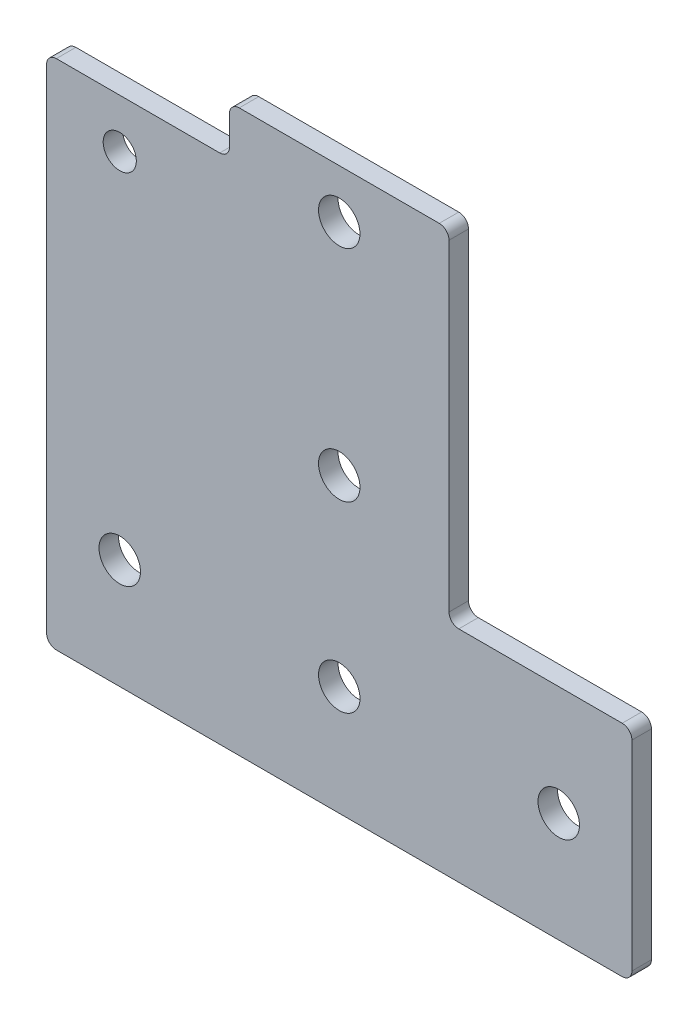
ISO-10303-21;
HEADER;
FILE_DESCRIPTION(('STEP AP214'),'2;1');
FILE_NAME('part.step','',(''),(''),'','','');
FILE_SCHEMA(('AUTOMOTIVE_DESIGN { 1 0 10303 214 1 1 1 1 }'));
ENDSEC;
DATA;
#1=APPLICATION_CONTEXT('core data for automotive mechanical design processes');
#2=APPLICATION_PROTOCOL_DEFINITION('international standard','automotive_design',2000,#1);
#3=PRODUCT_CONTEXT('',#1,'mechanical');
#4=PRODUCT('Part','Part','',(#3));
#5=PRODUCT_RELATED_PRODUCT_CATEGORY('part','',(#4));
#6=PRODUCT_DEFINITION_FORMATION('','',#4);
#7=PRODUCT_DEFINITION_CONTEXT('part definition',#1,'design');
#8=PRODUCT_DEFINITION('design','',#6,#7);
#9=PRODUCT_DEFINITION_SHAPE('','',#8);
#10=(LENGTH_UNIT() NAMED_UNIT(*) SI_UNIT(.MILLI.,.METRE.));
#11=(NAMED_UNIT(*) PLANE_ANGLE_UNIT() SI_UNIT($,.RADIAN.));
#12=(NAMED_UNIT(*) SI_UNIT($,.STERADIAN.) SOLID_ANGLE_UNIT());
#13=UNCERTAINTY_MEASURE_WITH_UNIT(LENGTH_MEASURE(1.E-05),#10,'distance_accuracy_value','');
#14=(GEOMETRIC_REPRESENTATION_CONTEXT(3) GLOBAL_UNCERTAINTY_ASSIGNED_CONTEXT((#13)) GLOBAL_UNIT_ASSIGNED_CONTEXT((#10,
#11,#12)) REPRESENTATION_CONTEXT('',''));
#15=CARTESIAN_POINT('',(0.,0.,0.));
#16=DIRECTION('',(0.,0.,1.));
#17=DIRECTION('',(1.,0.,0.));
#18=AXIS2_PLACEMENT_3D('',#15,#16,#17);
#19=CARTESIAN_POINT('',(0.,0.,4.));
#20=DIRECTION('',(0.,0.,-1.));
#21=DIRECTION('',(-1.,0.,0.));
#22=AXIS2_PLACEMENT_3D('',#19,#20,#21);
#23=PLANE('',#22);
#24=DIRECTION('',(-1.,0.,0.));
#25=VECTOR('',#24,1.);
#26=CARTESIAN_POINT('',(-60.,105.,4.));
#27=LINE('',#26,#25);
#28=CARTESIAN_POINT('',(-24.5,105.,4.));
#29=VERTEX_POINT('',#28);
#30=CARTESIAN_POINT('',(-58.,105.,4.));
#31=VERTEX_POINT('',#30);
#32=EDGE_CURVE('E192',#29,#31,#27,.T.);
#33=ORIENTED_EDGE('',*,*,#32,.T.);
#34=CARTESIAN_POINT('',(-58.,103.,4.));
#35=DIRECTION('',(0.,0.,-1.));
#36=DIRECTION('',(-1.,0.,0.));
#37=AXIS2_PLACEMENT_3D('',#34,#35,#36);
#38=CIRCLE('',#37,2.);
#39=CARTESIAN_POINT('',(-60.,103.,4.));
#40=VERTEX_POINT('',#39);
#41=EDGE_CURVE('E219',#31,#40,#38,.F.);
#42=ORIENTED_EDGE('',*,*,#41,.T.);
#43=DIRECTION('',(0.,-1.,0.));
#44=VECTOR('',#43,1.);
#45=CARTESIAN_POINT('',(-60.,0.,4.));
#46=LINE('',#45,#44);
#47=CARTESIAN_POINT('',(-60.,2.,4.));
#48=VERTEX_POINT('',#47);
#49=EDGE_CURVE('E176',#40,#48,#46,.T.);
#50=ORIENTED_EDGE('',*,*,#49,.T.);
#51=CARTESIAN_POINT('',(-58.,2.,4.));
#52=DIRECTION('',(0.,0.,-1.));
#53=DIRECTION('',(-1.,0.,0.));
#54=AXIS2_PLACEMENT_3D('',#51,#52,#53);
#55=CIRCLE('',#54,2.);
#56=CARTESIAN_POINT('',(-58.,0.,4.));
#57=VERTEX_POINT('',#56);
#58=EDGE_CURVE('E216',#48,#57,#55,.F.);
#59=ORIENTED_EDGE('',*,*,#58,.T.);
#60=DIRECTION('',(1.,0.,0.));
#61=VECTOR('',#60,1.);
#62=CARTESIAN_POINT('',(-60.,0.,4.));
#63=LINE('',#62,#61);
#64=CARTESIAN_POINT('',(58.,0.,4.));
#65=VERTEX_POINT('',#64);
#66=EDGE_CURVE('E186',#57,#65,#63,.T.);
#67=ORIENTED_EDGE('',*,*,#66,.T.);
#68=CARTESIAN_POINT('',(58.,2.,4.));
#69=DIRECTION('',(0.,0.,-1.));
#70=DIRECTION('',(-1.,0.,0.));
#71=AXIS2_PLACEMENT_3D('',#68,#69,#70);
#72=CIRCLE('',#71,2.);
#73=CARTESIAN_POINT('',(60.,2.,4.));
#74=VERTEX_POINT('',#73);
#75=EDGE_CURVE('E205',#65,#74,#72,.F.);
#76=ORIENTED_EDGE('',*,*,#75,.T.);
#77=DIRECTION('',(0.,1.,0.));
#78=VECTOR('',#77,1.);
#79=CARTESIAN_POINT('',(60.,0.,4.));
#80=LINE('',#79,#78);
#81=CARTESIAN_POINT('',(60.,43.,4.));
#82=VERTEX_POINT('',#81);
#83=EDGE_CURVE('E288',#74,#82,#80,.T.);
#84=ORIENTED_EDGE('',*,*,#83,.T.);
#85=CARTESIAN_POINT('',(58.,43.,4.));
#86=DIRECTION('',(0.,0.,-1.));
#87=DIRECTION('',(-1.,0.,0.));
#88=AXIS2_PLACEMENT_3D('',#85,#86,#87);
#89=CIRCLE('',#88,2.);
#90=CARTESIAN_POINT('',(58.,45.,4.));
#91=VERTEX_POINT('',#90);
#92=EDGE_CURVE('E208',#82,#91,#89,.F.);
#93=ORIENTED_EDGE('',*,*,#92,.T.);
#94=DIRECTION('',(-1.,0.,0.));
#95=VECTOR('',#94,1.);
#96=CARTESIAN_POINT('',(22.5,45.,4.));
#97=LINE('',#96,#95);
#98=CARTESIAN_POINT('',(24.5,45.,4.));
#99=VERTEX_POINT('',#98);
#100=EDGE_CURVE('E292',#91,#99,#97,.T.);
#101=ORIENTED_EDGE('',*,*,#100,.T.);
#102=CARTESIAN_POINT('',(24.5,47.,4.));
#103=DIRECTION('',(0.,0.,-1.));
#104=DIRECTION('',(-1.,0.,0.));
#105=AXIS2_PLACEMENT_3D('',#102,#103,#104);
#106=CIRCLE('',#105,2.);
#107=CARTESIAN_POINT('',(22.5,47.,4.));
#108=VERTEX_POINT('',#107);
#109=EDGE_CURVE('E12',#99,#108,#106,.T.);
#110=ORIENTED_EDGE('',*,*,#109,.T.);
#111=DIRECTION('',(0.,1.,0.));
#112=VECTOR('',#111,1.);
#113=CARTESIAN_POINT('',(22.5,45.,4.));
#114=LINE('',#113,#112);
#115=CARTESIAN_POINT('',(22.5,113.,4.));
#116=VERTEX_POINT('',#115);
#117=EDGE_CURVE('E297',#108,#116,#114,.T.);
#118=ORIENTED_EDGE('',*,*,#117,.T.);
#119=CARTESIAN_POINT('',(20.5,113.,4.));
#120=DIRECTION('',(0.,0.,-1.));
#121=DIRECTION('',(-1.,0.,0.));
#122=AXIS2_PLACEMENT_3D('',#119,#120,#121);
#123=CIRCLE('',#122,2.);
#124=CARTESIAN_POINT('',(20.5,115.,4.));
#125=VERTEX_POINT('',#124);
#126=EDGE_CURVE('E211',#116,#125,#123,.F.);
#127=ORIENTED_EDGE('',*,*,#126,.T.);
#128=DIRECTION('',(-1.,0.,0.));
#129=VECTOR('',#128,1.);
#130=CARTESIAN_POINT('',(-22.5,115.,4.));
#131=LINE('',#130,#129);
#132=CARTESIAN_POINT('',(-20.5,115.,4.));
#133=VERTEX_POINT('',#132);
#134=EDGE_CURVE('E302',#125,#133,#131,.T.);
#135=ORIENTED_EDGE('',*,*,#134,.T.);
#136=CARTESIAN_POINT('',(-20.5,113.,4.));
#137=DIRECTION('',(0.,0.,-1.));
#138=DIRECTION('',(-1.,0.,0.));
#139=AXIS2_PLACEMENT_3D('',#136,#137,#138);
#140=CIRCLE('',#139,2.);
#141=CARTESIAN_POINT('',(-22.5,113.,4.));
#142=VERTEX_POINT('',#141);
#143=EDGE_CURVE('E64',#133,#142,#140,.F.);
#144=ORIENTED_EDGE('',*,*,#143,.T.);
#145=DIRECTION('',(0.,-1.,0.));
#146=VECTOR('',#145,1.);
#147=CARTESIAN_POINT('',(-22.5,105.,4.));
#148=LINE('',#147,#146);
#149=CARTESIAN_POINT('',(-22.5,107.,4.));
#150=VERTEX_POINT('',#149);
#151=EDGE_CURVE('E306',#142,#150,#148,.T.);
#152=ORIENTED_EDGE('',*,*,#151,.T.);
#153=CARTESIAN_POINT('',(-24.5,107.,4.));
#154=DIRECTION('',(0.,0.,-1.));
#155=DIRECTION('',(-1.,0.,0.));
#156=AXIS2_PLACEMENT_3D('',#153,#154,#155);
#157=CIRCLE('',#156,2.);
#158=EDGE_CURVE('E253',#150,#29,#157,.T.);
#159=ORIENTED_EDGE('',*,*,#158,.T.);
#160=EDGE_LOOP('',(#33,#42,#50,#59,#67,#76,#84,#93,#101,#110,#118,#127,#135,#144,#152,#159));
#161=FACE_BOUND('',#160,.T.);
#162=CARTESIAN_POINT('',(-45.,95.,4.));
#163=DIRECTION('',(0.,0.,1.));
#164=DIRECTION('',(1.,0.,0.));
#165=AXIS2_PLACEMENT_3D('',#162,#163,#164);
#166=CIRCLE('',#165,3.4);
#167=CARTESIAN_POINT('',(-41.6,95.,4.));
#168=VERTEX_POINT('',#167);
#169=EDGE_CURVE('E265',#168,#168,#166,.T.);
#170=ORIENTED_EDGE('',*,*,#169,.F.);
#171=EDGE_LOOP('',(#170));
#172=FACE_BOUND('',#171,.T.);
#173=CARTESIAN_POINT('',(0.,22.5,4.));
#174=DIRECTION('',(0.,0.,1.));
#175=DIRECTION('',(1.,0.,0.));
#176=AXIS2_PLACEMENT_3D('',#173,#174,#175);
#177=CIRCLE('',#176,4.25);
#178=CARTESIAN_POINT('',(4.25000000000001,22.5,4.));
#179=VERTEX_POINT('',#178);
#180=EDGE_CURVE('E275',#179,#179,#177,.T.);
#181=ORIENTED_EDGE('',*,*,#180,.F.);
#182=EDGE_LOOP('',(#181));
#183=FACE_BOUND('',#182,.T.);
#184=CARTESIAN_POINT('',(-45.,22.5,4.));
#185=DIRECTION('',(0.,0.,1.));
#186=DIRECTION('',(1.,0.,0.));
#187=AXIS2_PLACEMENT_3D('',#184,#185,#186);
#188=CIRCLE('',#187,4.25);
#189=CARTESIAN_POINT('',(-40.75,22.5,4.));
#190=VERTEX_POINT('',#189);
#191=EDGE_CURVE('E411',#190,#190,#188,.T.);
#192=ORIENTED_EDGE('',*,*,#191,.F.);
#193=EDGE_LOOP('',(#192));
#194=FACE_BOUND('',#193,.T.);
#195=CARTESIAN_POINT('',(45.,22.5,4.));
#196=DIRECTION('',(0.,0.,1.));
#197=DIRECTION('',(1.,0.,0.));
#198=AXIS2_PLACEMENT_3D('',#195,#196,#197);
#199=CIRCLE('',#198,4.25);
#200=CARTESIAN_POINT('',(49.25,22.5,4.));
#201=VERTEX_POINT('',#200);
#202=EDGE_CURVE('E404',#201,#201,#199,.T.);
#203=ORIENTED_EDGE('',*,*,#202,.F.);
#204=EDGE_LOOP('',(#203));
#205=FACE_BOUND('',#204,.T.);
#206=CARTESIAN_POINT('',(0.,105.,4.));
#207=DIRECTION('',(0.,0.,1.));
#208=DIRECTION('',(1.,0.,0.));
#209=AXIS2_PLACEMENT_3D('',#206,#207,#208);
#210=CIRCLE('',#209,4.25000000000001);
#211=CARTESIAN_POINT('',(4.25000000000001,105.,4.));
#212=VERTEX_POINT('',#211);
#213=EDGE_CURVE('E395',#212,#212,#210,.T.);
#214=ORIENTED_EDGE('',*,*,#213,.F.);
#215=EDGE_LOOP('',(#214));
#216=FACE_BOUND('',#215,.T.);
#217=CARTESIAN_POINT('',(0.,60.,4.));
#218=DIRECTION('',(0.,0.,1.));
#219=DIRECTION('',(1.,0.,0.));
#220=AXIS2_PLACEMENT_3D('',#217,#218,#219);
#221=CIRCLE('',#220,4.25000000000001);
#222=CARTESIAN_POINT('',(4.25000000000002,60.,4.));
#223=VERTEX_POINT('',#222);
#224=EDGE_CURVE('E385',#223,#223,#221,.T.);
#225=ORIENTED_EDGE('',*,*,#224,.F.);
#226=EDGE_LOOP('',(#225));
#227=FACE_BOUND('',#226,.T.);
#228=ADVANCED_FACE('F40',(#161,#172,#183,#194,#205,#216,#227),#23,.F.);
#229=CARTESIAN_POINT('',(0.,0.,0.));
#230=DIRECTION('',(0.,0.,-1.));
#231=DIRECTION('',(-1.,0.,0.));
#232=AXIS2_PLACEMENT_3D('',#229,#230,#231);
#233=PLANE('',#232);
#234=CARTESIAN_POINT('',(0.,105.,0.));
#235=DIRECTION('',(0.,0.,1.));
#236=DIRECTION('',(1.,0.,0.));
#237=AXIS2_PLACEMENT_3D('',#234,#235,#236);
#238=CIRCLE('',#237,4.25000000000001);
#239=CARTESIAN_POINT('',(4.25000000000001,105.,0.));
#240=VERTEX_POINT('',#239);
#241=EDGE_CURVE('E392',#240,#240,#238,.T.);
#242=ORIENTED_EDGE('',*,*,#241,.T.);
#243=EDGE_LOOP('',(#242));
#244=FACE_BOUND('',#243,.T.);
#245=CARTESIAN_POINT('',(-45.,22.5,0.));
#246=DIRECTION('',(0.,0.,1.));
#247=DIRECTION('',(1.,0.,0.));
#248=AXIS2_PLACEMENT_3D('',#245,#246,#247);
#249=CIRCLE('',#248,4.25);
#250=CARTESIAN_POINT('',(-40.75,22.5,0.));
#251=VERTEX_POINT('',#250);
#252=EDGE_CURVE('E409',#251,#251,#249,.T.);
#253=ORIENTED_EDGE('',*,*,#252,.T.);
#254=EDGE_LOOP('',(#253));
#255=FACE_BOUND('',#254,.T.);
#256=CARTESIAN_POINT('',(-45.,95.,0.));
#257=DIRECTION('',(0.,0.,1.));
#258=DIRECTION('',(1.,0.,0.));
#259=AXIS2_PLACEMENT_3D('',#256,#257,#258);
#260=CIRCLE('',#259,3.4);
#261=CARTESIAN_POINT('',(-41.6,95.,0.));
#262=VERTEX_POINT('',#261);
#263=EDGE_CURVE('E272',#262,#262,#260,.T.);
#264=ORIENTED_EDGE('',*,*,#263,.T.);
#265=EDGE_LOOP('',(#264));
#266=FACE_BOUND('',#265,.T.);
#267=DIRECTION('',(0.,-1.,0.));
#268=VECTOR('',#267,1.);
#269=CARTESIAN_POINT('',(-60.,45.,0.));
#270=LINE('',#269,#268);
#271=CARTESIAN_POINT('',(-60.,103.,0.));
#272=VERTEX_POINT('',#271);
#273=CARTESIAN_POINT('',(-60.,2.,0.));
#274=VERTEX_POINT('',#273);
#275=EDGE_CURVE('E173',#272,#274,#270,.T.);
#276=ORIENTED_EDGE('',*,*,#275,.F.);
#277=CARTESIAN_POINT('',(-58.,103.,0.));
#278=DIRECTION('',(0.,0.,-1.));
#279=DIRECTION('',(-1.,0.,0.));
#280=AXIS2_PLACEMENT_3D('',#277,#278,#279);
#281=CIRCLE('',#280,2.);
#282=CARTESIAN_POINT('',(-58.,105.,0.));
#283=VERTEX_POINT('',#282);
#284=EDGE_CURVE('E156',#272,#283,#281,.T.);
#285=ORIENTED_EDGE('',*,*,#284,.T.);
#286=DIRECTION('',(-1.,0.,0.));
#287=VECTOR('',#286,1.);
#288=CARTESIAN_POINT('',(-60.,105.,0.));
#289=LINE('',#288,#287);
#290=CARTESIAN_POINT('',(-24.5,105.,0.));
#291=VERTEX_POINT('',#290);
#292=EDGE_CURVE('E183',#291,#283,#289,.T.);
#293=ORIENTED_EDGE('',*,*,#292,.F.);
#294=CARTESIAN_POINT('',(-24.5,107.,0.));
#295=DIRECTION('',(0.,0.,-1.));
#296=DIRECTION('',(-1.,0.,0.));
#297=AXIS2_PLACEMENT_3D('',#294,#295,#296);
#298=CIRCLE('',#297,2.);
#299=CARTESIAN_POINT('',(-22.5,107.,0.));
#300=VERTEX_POINT('',#299);
#301=EDGE_CURVE('E251',#291,#300,#298,.F.);
#302=ORIENTED_EDGE('',*,*,#301,.T.);
#303=DIRECTION('',(0.,-1.,0.));
#304=VECTOR('',#303,1.);
#305=CARTESIAN_POINT('',(-22.5,105.,0.));
#306=LINE('',#305,#304);
#307=CARTESIAN_POINT('',(-22.5,113.,0.));
#308=VERTEX_POINT('',#307);
#309=EDGE_CURVE('E188',#308,#300,#306,.T.);
#310=ORIENTED_EDGE('',*,*,#309,.F.);
#311=CARTESIAN_POINT('',(-20.5,113.,0.));
#312=DIRECTION('',(0.,0.,-1.));
#313=DIRECTION('',(-1.,0.,0.));
#314=AXIS2_PLACEMENT_3D('',#311,#312,#313);
#315=CIRCLE('',#314,2.);
#316=CARTESIAN_POINT('',(-20.5,115.,0.));
#317=VERTEX_POINT('',#316);
#318=EDGE_CURVE('E199',#308,#317,#315,.T.);
#319=ORIENTED_EDGE('',*,*,#318,.T.);
#320=DIRECTION('',(-1.,0.,0.));
#321=VECTOR('',#320,1.);
#322=CARTESIAN_POINT('',(-22.5,115.,0.));
#323=LINE('',#322,#321);
#324=CARTESIAN_POINT('',(20.5,115.,0.));
#325=VERTEX_POINT('',#324);
#326=EDGE_CURVE('E324',#325,#317,#323,.T.);
#327=ORIENTED_EDGE('',*,*,#326,.F.);
#328=CARTESIAN_POINT('',(20.5,113.,0.));
#329=DIRECTION('',(0.,0.,-1.));
#330=DIRECTION('',(-1.,0.,0.));
#331=AXIS2_PLACEMENT_3D('',#328,#329,#330);
#332=CIRCLE('',#331,2.);
#333=CARTESIAN_POINT('',(22.5,113.,0.));
#334=VERTEX_POINT('',#333);
#335=EDGE_CURVE('E197',#325,#334,#332,.T.);
#336=ORIENTED_EDGE('',*,*,#335,.T.);
#337=DIRECTION('',(0.,1.,0.));
#338=VECTOR('',#337,1.);
#339=CARTESIAN_POINT('',(22.5,45.,0.));
#340=LINE('',#339,#338);
#341=CARTESIAN_POINT('',(22.5,47.,0.));
#342=VERTEX_POINT('',#341);
#343=EDGE_CURVE('E321',#342,#334,#340,.T.);
#344=ORIENTED_EDGE('',*,*,#343,.F.);
#345=CARTESIAN_POINT('',(24.5,47.,0.));
#346=DIRECTION('',(0.,0.,-1.));
#347=DIRECTION('',(-1.,0.,0.));
#348=AXIS2_PLACEMENT_3D('',#345,#346,#347);
#349=CIRCLE('',#348,2.);
#350=CARTESIAN_POINT('',(24.5,45.,0.));
#351=VERTEX_POINT('',#350);
#352=EDGE_CURVE('E50',#342,#351,#349,.F.);
#353=ORIENTED_EDGE('',*,*,#352,.T.);
#354=DIRECTION('',(-1.,0.,0.));
#355=VECTOR('',#354,1.);
#356=CARTESIAN_POINT('',(22.5,45.,0.));
#357=LINE('',#356,#355);
#358=CARTESIAN_POINT('',(58.,45.,0.));
#359=VERTEX_POINT('',#358);
#360=EDGE_CURVE('E318',#359,#351,#357,.T.);
#361=ORIENTED_EDGE('',*,*,#360,.F.);
#362=CARTESIAN_POINT('',(58.,43.,0.));
#363=DIRECTION('',(0.,0.,-1.));
#364=DIRECTION('',(-1.,0.,0.));
#365=AXIS2_PLACEMENT_3D('',#362,#363,#364);
#366=CIRCLE('',#365,2.);
#367=CARTESIAN_POINT('',(60.,43.,0.));
#368=VERTEX_POINT('',#367);
#369=EDGE_CURVE('E195',#359,#368,#366,.T.);
#370=ORIENTED_EDGE('',*,*,#369,.T.);
#371=DIRECTION('',(0.,1.,0.));
#372=VECTOR('',#371,1.);
#373=CARTESIAN_POINT('',(60.,0.,0.));
#374=LINE('',#373,#372);
#375=CARTESIAN_POINT('',(60.,2.,0.));
#376=VERTEX_POINT('',#375);
#377=EDGE_CURVE('E315',#376,#368,#374,.T.);
#378=ORIENTED_EDGE('',*,*,#377,.F.);
#379=CARTESIAN_POINT('',(58.,2.,0.));
#380=DIRECTION('',(0.,0.,-1.));
#381=DIRECTION('',(-1.,0.,0.));
#382=AXIS2_PLACEMENT_3D('',#379,#380,#381);
#383=CIRCLE('',#382,2.);
#384=CARTESIAN_POINT('',(58.,0.,0.));
#385=VERTEX_POINT('',#384);
#386=EDGE_CURVE('E177',#376,#385,#383,.T.);
#387=ORIENTED_EDGE('',*,*,#386,.T.);
#388=DIRECTION('',(1.,0.,0.));
#389=VECTOR('',#388,1.);
#390=CARTESIAN_POINT('',(-60.,0.,0.));
#391=LINE('',#390,#389);
#392=CARTESIAN_POINT('',(-58.,0.,0.));
#393=VERTEX_POINT('',#392);
#394=EDGE_CURVE('E271',#393,#385,#391,.T.);
#395=ORIENTED_EDGE('',*,*,#394,.F.);
#396=CARTESIAN_POINT('',(-58.,2.,0.));
#397=DIRECTION('',(0.,0.,-1.));
#398=DIRECTION('',(-1.,0.,0.));
#399=AXIS2_PLACEMENT_3D('',#396,#397,#398);
#400=CIRCLE('',#399,2.);
#401=EDGE_CURVE('E167',#393,#274,#400,.T.);
#402=ORIENTED_EDGE('',*,*,#401,.T.);
#403=EDGE_LOOP('',(#276,#285,#293,#302,#310,#319,#327,#336,#344,#353,#361,#370,#378,#387,#395,#402));
#404=FACE_BOUND('',#403,.T.);
#405=CARTESIAN_POINT('',(0.,22.5,0.));
#406=DIRECTION('',(0.,0.,1.));
#407=DIRECTION('',(1.,0.,0.));
#408=AXIS2_PLACEMENT_3D('',#405,#406,#407);
#409=CIRCLE('',#408,4.25);
#410=CARTESIAN_POINT('',(4.25000000000001,22.5,0.));
#411=VERTEX_POINT('',#410);
#412=EDGE_CURVE('E273',#411,#411,#409,.T.);
#413=ORIENTED_EDGE('',*,*,#412,.T.);
#414=EDGE_LOOP('',(#413));
#415=FACE_BOUND('',#414,.T.);
#416=CARTESIAN_POINT('',(45.,22.5,0.));
#417=DIRECTION('',(0.,0.,1.));
#418=DIRECTION('',(1.,0.,0.));
#419=AXIS2_PLACEMENT_3D('',#416,#417,#418);
#420=CIRCLE('',#419,4.25);
#421=CARTESIAN_POINT('',(49.25,22.5,0.));
#422=VERTEX_POINT('',#421);
#423=EDGE_CURVE('E400',#422,#422,#420,.T.);
#424=ORIENTED_EDGE('',*,*,#423,.T.);
#425=EDGE_LOOP('',(#424));
#426=FACE_BOUND('',#425,.T.);
#427=CARTESIAN_POINT('',(0.,60.,0.));
#428=DIRECTION('',(0.,0.,1.));
#429=DIRECTION('',(1.,0.,0.));
#430=AXIS2_PLACEMENT_3D('',#427,#428,#429);
#431=CIRCLE('',#430,4.25000000000001);
#432=CARTESIAN_POINT('',(4.25000000000002,60.,0.));
#433=VERTEX_POINT('',#432);
#434=EDGE_CURVE('E388',#433,#433,#431,.T.);
#435=ORIENTED_EDGE('',*,*,#434,.T.);
#436=EDGE_LOOP('',(#435));
#437=FACE_BOUND('',#436,.T.);
#438=ADVANCED_FACE('F180',(#244,#255,#266,#404,#415,#426,#437),#233,.T.);
#439=CARTESIAN_POINT('',(-60.,0.,4.));
#440=DIRECTION('',(0.,1.,0.));
#441=DIRECTION('',(0.,0.,1.));
#442=AXIS2_PLACEMENT_3D('',#439,#440,#441);
#443=PLANE('',#442);
#444=ORIENTED_EDGE('',*,*,#66,.F.);
#445=DIRECTION('',(0.,0.,-1.));
#446=VECTOR('',#445,1.);
#447=CARTESIAN_POINT('',(-58.,0.,4.));
#448=LINE('',#447,#446);
#449=EDGE_CURVE('E238',#57,#393,#448,.T.);
#450=ORIENTED_EDGE('',*,*,#449,.T.);
#451=ORIENTED_EDGE('',*,*,#394,.T.);
#452=DIRECTION('',(0.,0.,-1.));
#453=VECTOR('',#452,1.);
#454=CARTESIAN_POINT('',(58.,0.,4.));
#455=LINE('',#454,#453);
#456=EDGE_CURVE('E236',#385,#65,#455,.F.);
#457=ORIENTED_EDGE('',*,*,#456,.T.);
#458=EDGE_LOOP('',(#444,#450,#451,#457));
#459=FACE_BOUND('',#458,.T.);
#460=ADVANCED_FACE('F352',(#459),#443,.F.);
#461=CARTESIAN_POINT('',(60.,0.,4.));
#462=DIRECTION('',(-1.,0.,0.));
#463=DIRECTION('',(0.,0.,1.));
#464=AXIS2_PLACEMENT_3D('',#461,#462,#463);
#465=PLANE('',#464);
#466=ORIENTED_EDGE('',*,*,#377,.T.);
#467=DIRECTION('',(0.,0.,-1.));
#468=VECTOR('',#467,1.);
#469=CARTESIAN_POINT('',(60.,43.,4.));
#470=LINE('',#469,#468);
#471=EDGE_CURVE('E249',#368,#82,#470,.F.);
#472=ORIENTED_EDGE('',*,*,#471,.T.);
#473=ORIENTED_EDGE('',*,*,#83,.F.);
#474=DIRECTION('',(0.,0.,-1.));
#475=VECTOR('',#474,1.);
#476=CARTESIAN_POINT('',(60.,2.,4.));
#477=LINE('',#476,#475);
#478=EDGE_CURVE('E246',#74,#376,#477,.T.);
#479=ORIENTED_EDGE('',*,*,#478,.T.);
#480=EDGE_LOOP('',(#466,#472,#473,#479));
#481=FACE_BOUND('',#480,.T.);
#482=ADVANCED_FACE('F457',(#481),#465,.F.);
#483=CARTESIAN_POINT('',(22.5,45.,4.));
#484=DIRECTION('',(0.,-1.,0.));
#485=DIRECTION('',(0.,0.,-1.));
#486=AXIS2_PLACEMENT_3D('',#483,#484,#485);
#487=PLANE('',#486);
#488=ORIENTED_EDGE('',*,*,#360,.T.);
#489=DIRECTION('',(0.,0.,-1.));
#490=VECTOR('',#489,1.);
#491=CARTESIAN_POINT('',(24.5,45.,4.));
#492=LINE('',#491,#490);
#493=EDGE_CURVE('E234',#351,#99,#492,.F.);
#494=ORIENTED_EDGE('',*,*,#493,.T.);
#495=ORIENTED_EDGE('',*,*,#100,.F.);
#496=DIRECTION('',(0.,0.,-1.));
#497=VECTOR('',#496,1.);
#498=CARTESIAN_POINT('',(58.,45.,4.));
#499=LINE('',#498,#497);
#500=EDGE_CURVE('E231',#91,#359,#499,.T.);
#501=ORIENTED_EDGE('',*,*,#500,.T.);
#502=EDGE_LOOP('',(#488,#494,#495,#501));
#503=FACE_BOUND('',#502,.T.);
#504=ADVANCED_FACE('F466',(#503),#487,.F.);
#505=CARTESIAN_POINT('',(22.5,45.,4.));
#506=DIRECTION('',(-1.,0.,0.));
#507=DIRECTION('',(0.,-1.,0.));
#508=AXIS2_PLACEMENT_3D('',#505,#506,#507);
#509=PLANE('',#508);
#510=ORIENTED_EDGE('',*,*,#117,.F.);
#511=DIRECTION('',(0.,0.,-1.));
#512=VECTOR('',#511,1.);
#513=CARTESIAN_POINT('',(22.5,47.,0.));
#514=LINE('',#513,#512);
#515=EDGE_CURVE('E228',#108,#342,#514,.T.);
#516=ORIENTED_EDGE('',*,*,#515,.T.);
#517=ORIENTED_EDGE('',*,*,#343,.T.);
#518=DIRECTION('',(0.,0.,-1.));
#519=VECTOR('',#518,1.);
#520=CARTESIAN_POINT('',(22.5,113.,4.));
#521=LINE('',#520,#519);
#522=EDGE_CURVE('E226',#334,#116,#521,.F.);
#523=ORIENTED_EDGE('',*,*,#522,.T.);
#524=EDGE_LOOP('',(#510,#516,#517,#523));
#525=FACE_BOUND('',#524,.T.);
#526=ADVANCED_FACE('F475',(#525),#509,.F.);
#527=CARTESIAN_POINT('',(-22.5,115.,4.));
#528=DIRECTION('',(0.,-1.,0.));
#529=DIRECTION('',(0.,0.,-1.));
#530=AXIS2_PLACEMENT_3D('',#527,#528,#529);
#531=PLANE('',#530);
#532=ORIENTED_EDGE('',*,*,#326,.T.);
#533=DIRECTION('',(0.,0.,-1.));
#534=VECTOR('',#533,1.);
#535=CARTESIAN_POINT('',(-20.5,115.,4.));
#536=LINE('',#535,#534);
#537=EDGE_CURVE('E244',#317,#133,#536,.F.);
#538=ORIENTED_EDGE('',*,*,#537,.T.);
#539=ORIENTED_EDGE('',*,*,#134,.F.);
#540=DIRECTION('',(0.,0.,-1.));
#541=VECTOR('',#540,1.);
#542=CARTESIAN_POINT('',(20.5,115.,4.));
#543=LINE('',#542,#541);
#544=EDGE_CURVE('E241',#125,#325,#543,.T.);
#545=ORIENTED_EDGE('',*,*,#544,.T.);
#546=EDGE_LOOP('',(#532,#538,#539,#545));
#547=FACE_BOUND('',#546,.T.);
#548=ADVANCED_FACE('F345',(#547),#531,.F.);
#549=CARTESIAN_POINT('',(-22.5,105.,4.));
#550=DIRECTION('',(1.,0.,0.));
#551=DIRECTION('',(0.,0.,-1.));
#552=AXIS2_PLACEMENT_3D('',#549,#550,#551);
#553=PLANE('',#552);
#554=ORIENTED_EDGE('',*,*,#309,.T.);
#555=DIRECTION('',(0.,0.,-1.));
#556=VECTOR('',#555,1.);
#557=CARTESIAN_POINT('',(-22.5,107.,4.));
#558=LINE('',#557,#556);
#559=EDGE_CURVE('E57',#300,#150,#558,.F.);
#560=ORIENTED_EDGE('',*,*,#559,.T.);
#561=ORIENTED_EDGE('',*,*,#151,.F.);
#562=DIRECTION('',(0.,0.,-1.));
#563=VECTOR('',#562,1.);
#564=CARTESIAN_POINT('',(-22.5,113.,4.));
#565=LINE('',#564,#563);
#566=EDGE_CURVE('E222',#142,#308,#565,.T.);
#567=ORIENTED_EDGE('',*,*,#566,.T.);
#568=EDGE_LOOP('',(#554,#560,#561,#567));
#569=FACE_BOUND('',#568,.T.);
#570=ADVANCED_FACE('F327',(#569),#553,.F.);
#571=CARTESIAN_POINT('',(-60.,105.,4.));
#572=DIRECTION('',(0.,-1.,0.));
#573=DIRECTION('',(0.,0.,-1.));
#574=AXIS2_PLACEMENT_3D('',#571,#572,#573);
#575=PLANE('',#574);
#576=ORIENTED_EDGE('',*,*,#292,.T.);
#577=DIRECTION('',(0.,0.,-1.));
#578=VECTOR('',#577,1.);
#579=CARTESIAN_POINT('',(-58.,105.,4.));
#580=LINE('',#579,#578);
#581=EDGE_CURVE('E161',#283,#31,#580,.F.);
#582=ORIENTED_EDGE('',*,*,#581,.T.);
#583=ORIENTED_EDGE('',*,*,#32,.F.);
#584=DIRECTION('',(0.,0.,-1.));
#585=VECTOR('',#584,1.);
#586=CARTESIAN_POINT('',(-24.5,105.,0.));
#587=LINE('',#586,#585);
#588=EDGE_CURVE('E166',#29,#291,#587,.T.);
#589=ORIENTED_EDGE('',*,*,#588,.T.);
#590=EDGE_LOOP('',(#576,#582,#583,#589));
#591=FACE_BOUND('',#590,.T.);
#592=ADVANCED_FACE('F336',(#591),#575,.F.);
#593=CARTESIAN_POINT('',(-60.,45.,4.));
#594=DIRECTION('',(1.,0.,0.));
#595=DIRECTION('',(0.,0.,-1.));
#596=AXIS2_PLACEMENT_3D('',#593,#594,#595);
#597=PLANE('',#596);
#598=ORIENTED_EDGE('',*,*,#49,.F.);
#599=DIRECTION('',(0.,0.,-1.));
#600=VECTOR('',#599,1.);
#601=CARTESIAN_POINT('',(-60.,103.,4.));
#602=LINE('',#601,#600);
#603=EDGE_CURVE('E160',#40,#272,#602,.T.);
#604=ORIENTED_EDGE('',*,*,#603,.T.);
#605=ORIENTED_EDGE('',*,*,#275,.T.);
#606=DIRECTION('',(0.,0.,-1.));
#607=VECTOR('',#606,1.);
#608=CARTESIAN_POINT('',(-60.,2.,4.));
#609=LINE('',#608,#607);
#610=EDGE_CURVE('E178',#274,#48,#609,.F.);
#611=ORIENTED_EDGE('',*,*,#610,.T.);
#612=EDGE_LOOP('',(#598,#604,#605,#611));
#613=FACE_BOUND('',#612,.T.);
#614=ADVANCED_FACE('F172',(#613),#597,.F.);
#615=CARTESIAN_POINT('',(-45.,95.,4.));
#616=DIRECTION('',(0.,0.,-1.));
#617=DIRECTION('',(-1.,0.,0.));
#618=AXIS2_PLACEMENT_3D('',#615,#616,#617);
#619=CYLINDRICAL_SURFACE('',#618,3.4);
#620=ORIENTED_EDGE('',*,*,#169,.T.);
#621=EDGE_LOOP('',(#620));
#622=FACE_BOUND('',#621,.T.);
#623=ORIENTED_EDGE('',*,*,#263,.F.);
#624=EDGE_LOOP('',(#623));
#625=FACE_BOUND('',#624,.T.);
#626=ADVANCED_FACE('F343',(#622,#625),#619,.F.);
#627=CARTESIAN_POINT('',(0.,22.5,4.));
#628=DIRECTION('',(0.,0.,-1.));
#629=DIRECTION('',(-1.,0.,0.));
#630=AXIS2_PLACEMENT_3D('',#627,#628,#629);
#631=CYLINDRICAL_SURFACE('',#630,4.25);
#632=ORIENTED_EDGE('',*,*,#180,.T.);
#633=EDGE_LOOP('',(#632));
#634=FACE_BOUND('',#633,.T.);
#635=ORIENTED_EDGE('',*,*,#412,.F.);
#636=EDGE_LOOP('',(#635));
#637=FACE_BOUND('',#636,.T.);
#638=ADVANCED_FACE('F358',(#634,#637),#631,.F.);
#639=CARTESIAN_POINT('',(-45.,22.5,4.));
#640=DIRECTION('',(0.,0.,-1.));
#641=DIRECTION('',(-1.,0.,0.));
#642=AXIS2_PLACEMENT_3D('',#639,#640,#641);
#643=CYLINDRICAL_SURFACE('',#642,4.25);
#644=ORIENTED_EDGE('',*,*,#191,.T.);
#645=EDGE_LOOP('',(#644));
#646=FACE_BOUND('',#645,.T.);
#647=ORIENTED_EDGE('',*,*,#252,.F.);
#648=EDGE_LOOP('',(#647));
#649=FACE_BOUND('',#648,.T.);
#650=ADVANCED_FACE('F362',(#646,#649),#643,.F.);
#651=CARTESIAN_POINT('',(45.,22.5,4.));
#652=DIRECTION('',(0.,0.,-1.));
#653=DIRECTION('',(-1.,0.,0.));
#654=AXIS2_PLACEMENT_3D('',#651,#652,#653);
#655=CYLINDRICAL_SURFACE('',#654,4.25);
#656=ORIENTED_EDGE('',*,*,#202,.T.);
#657=EDGE_LOOP('',(#656));
#658=FACE_BOUND('',#657,.T.);
#659=ORIENTED_EDGE('',*,*,#423,.F.);
#660=EDGE_LOOP('',(#659));
#661=FACE_BOUND('',#660,.T.);
#662=ADVANCED_FACE('F366',(#658,#661),#655,.F.);
#663=CARTESIAN_POINT('',(0.,105.,4.));
#664=DIRECTION('',(0.,0.,-1.));
#665=DIRECTION('',(-1.,0.,0.));
#666=AXIS2_PLACEMENT_3D('',#663,#664,#665);
#667=CYLINDRICAL_SURFACE('',#666,4.25000000000001);
#668=ORIENTED_EDGE('',*,*,#213,.T.);
#669=EDGE_LOOP('',(#668));
#670=FACE_BOUND('',#669,.T.);
#671=ORIENTED_EDGE('',*,*,#241,.F.);
#672=EDGE_LOOP('',(#671));
#673=FACE_BOUND('',#672,.T.);
#674=ADVANCED_FACE('F370',(#670,#673),#667,.F.);
#675=CARTESIAN_POINT('',(0.,60.,4.));
#676=DIRECTION('',(0.,0.,-1.));
#677=DIRECTION('',(-1.,0.,0.));
#678=AXIS2_PLACEMENT_3D('',#675,#676,#677);
#679=CYLINDRICAL_SURFACE('',#678,4.25000000000001);
#680=ORIENTED_EDGE('',*,*,#224,.T.);
#681=EDGE_LOOP('',(#680));
#682=FACE_BOUND('',#681,.T.);
#683=ORIENTED_EDGE('',*,*,#434,.F.);
#684=EDGE_LOOP('',(#683));
#685=FACE_BOUND('',#684,.T.);
#686=ADVANCED_FACE('F374',(#682,#685),#679,.F.);
#687=CARTESIAN_POINT('',(-58.,103.,4.));
#688=DIRECTION('',(0.,0.,-1.));
#689=DIRECTION('',(-1.,0.,0.));
#690=AXIS2_PLACEMENT_3D('',#687,#688,#689);
#691=CYLINDRICAL_SURFACE('',#690,2.);
#692=ORIENTED_EDGE('',*,*,#41,.F.);
#693=ORIENTED_EDGE('',*,*,#581,.F.);
#694=ORIENTED_EDGE('',*,*,#284,.F.);
#695=ORIENTED_EDGE('',*,*,#603,.F.);
#696=EDGE_LOOP('',(#692,#693,#694,#695));
#697=FACE_BOUND('',#696,.T.);
#698=ADVANCED_FACE('F159',(#697),#691,.T.);
#699=CARTESIAN_POINT('',(-24.5,107.,4.));
#700=DIRECTION('',(0.,0.,1.));
#701=DIRECTION('',(1.,0.,0.));
#702=AXIS2_PLACEMENT_3D('',#699,#700,#701);
#703=CYLINDRICAL_SURFACE('',#702,2.);
#704=ORIENTED_EDGE('',*,*,#158,.F.);
#705=ORIENTED_EDGE('',*,*,#559,.F.);
#706=ORIENTED_EDGE('',*,*,#301,.F.);
#707=ORIENTED_EDGE('',*,*,#588,.F.);
#708=EDGE_LOOP('',(#704,#705,#706,#707));
#709=FACE_BOUND('',#708,.T.);
#710=ADVANCED_FACE('F331',(#709),#703,.F.);
#711=CARTESIAN_POINT('',(24.5,47.,4.));
#712=DIRECTION('',(0.,0.,1.));
#713=DIRECTION('',(1.,0.,0.));
#714=AXIS2_PLACEMENT_3D('',#711,#712,#713);
#715=CYLINDRICAL_SURFACE('',#714,2.);
#716=ORIENTED_EDGE('',*,*,#109,.F.);
#717=ORIENTED_EDGE('',*,*,#493,.F.);
#718=ORIENTED_EDGE('',*,*,#352,.F.);
#719=ORIENTED_EDGE('',*,*,#515,.F.);
#720=EDGE_LOOP('',(#716,#717,#718,#719));
#721=FACE_BOUND('',#720,.T.);
#722=ADVANCED_FACE('F472',(#721),#715,.F.);
#723=CARTESIAN_POINT('',(-58.,2.,4.));
#724=DIRECTION('',(0.,0.,-1.));
#725=DIRECTION('',(-1.,0.,0.));
#726=AXIS2_PLACEMENT_3D('',#723,#724,#725);
#727=CYLINDRICAL_SURFACE('',#726,2.);
#728=ORIENTED_EDGE('',*,*,#58,.F.);
#729=ORIENTED_EDGE('',*,*,#610,.F.);
#730=ORIENTED_EDGE('',*,*,#401,.F.);
#731=ORIENTED_EDGE('',*,*,#449,.F.);
#732=EDGE_LOOP('',(#728,#729,#730,#731));
#733=FACE_BOUND('',#732,.T.);
#734=ADVANCED_FACE('F488',(#733),#727,.T.);
#735=CARTESIAN_POINT('',(-20.5,113.,4.));
#736=DIRECTION('',(0.,0.,-1.));
#737=DIRECTION('',(-1.,0.,0.));
#738=AXIS2_PLACEMENT_3D('',#735,#736,#737);
#739=CYLINDRICAL_SURFACE('',#738,2.);
#740=ORIENTED_EDGE('',*,*,#143,.F.);
#741=ORIENTED_EDGE('',*,*,#537,.F.);
#742=ORIENTED_EDGE('',*,*,#318,.F.);
#743=ORIENTED_EDGE('',*,*,#566,.F.);
#744=EDGE_LOOP('',(#740,#741,#742,#743));
#745=FACE_BOUND('',#744,.T.);
#746=ADVANCED_FACE('F486',(#745),#739,.T.);
#747=CARTESIAN_POINT('',(20.5,113.,4.));
#748=DIRECTION('',(0.,0.,-1.));
#749=DIRECTION('',(-1.,0.,0.));
#750=AXIS2_PLACEMENT_3D('',#747,#748,#749);
#751=CYLINDRICAL_SURFACE('',#750,2.);
#752=ORIENTED_EDGE('',*,*,#126,.F.);
#753=ORIENTED_EDGE('',*,*,#522,.F.);
#754=ORIENTED_EDGE('',*,*,#335,.F.);
#755=ORIENTED_EDGE('',*,*,#544,.F.);
#756=EDGE_LOOP('',(#752,#753,#754,#755));
#757=FACE_BOUND('',#756,.T.);
#758=ADVANCED_FACE('F481',(#757),#751,.T.);
#759=CARTESIAN_POINT('',(58.,43.,4.));
#760=DIRECTION('',(0.,0.,-1.));
#761=DIRECTION('',(-1.,0.,0.));
#762=AXIS2_PLACEMENT_3D('',#759,#760,#761);
#763=CYLINDRICAL_SURFACE('',#762,2.);
#764=ORIENTED_EDGE('',*,*,#92,.F.);
#765=ORIENTED_EDGE('',*,*,#471,.F.);
#766=ORIENTED_EDGE('',*,*,#369,.F.);
#767=ORIENTED_EDGE('',*,*,#500,.F.);
#768=EDGE_LOOP('',(#764,#765,#766,#767));
#769=FACE_BOUND('',#768,.T.);
#770=ADVANCED_FACE('F463',(#769),#763,.T.);
#771=CARTESIAN_POINT('',(58.,2.,4.));
#772=DIRECTION('',(0.,0.,-1.));
#773=DIRECTION('',(-1.,0.,0.));
#774=AXIS2_PLACEMENT_3D('',#771,#772,#773);
#775=CYLINDRICAL_SURFACE('',#774,2.);
#776=ORIENTED_EDGE('',*,*,#75,.F.);
#777=ORIENTED_EDGE('',*,*,#456,.F.);
#778=ORIENTED_EDGE('',*,*,#386,.F.);
#779=ORIENTED_EDGE('',*,*,#478,.F.);
#780=EDGE_LOOP('',(#776,#777,#778,#779));
#781=FACE_BOUND('',#780,.T.);
#782=ADVANCED_FACE('F42',(#781),#775,.T.);
#783=CLOSED_SHELL('',(#228,#438,#460,#482,#504,#526,#548,#570,#592,#614,#626,#638,#650,#662,
#674,#686,#698,#710,#722,#734,#746,#758,#770,#782));
#784=MANIFOLD_SOLID_BREP('B2',#783);
#785=ADVANCED_BREP_SHAPE_REPRESENTATION('',(#18,#784),#14);
#786=SHAPE_DEFINITION_REPRESENTATION(#9,#785);
ENDSEC;
END-ISO-10303-21;
